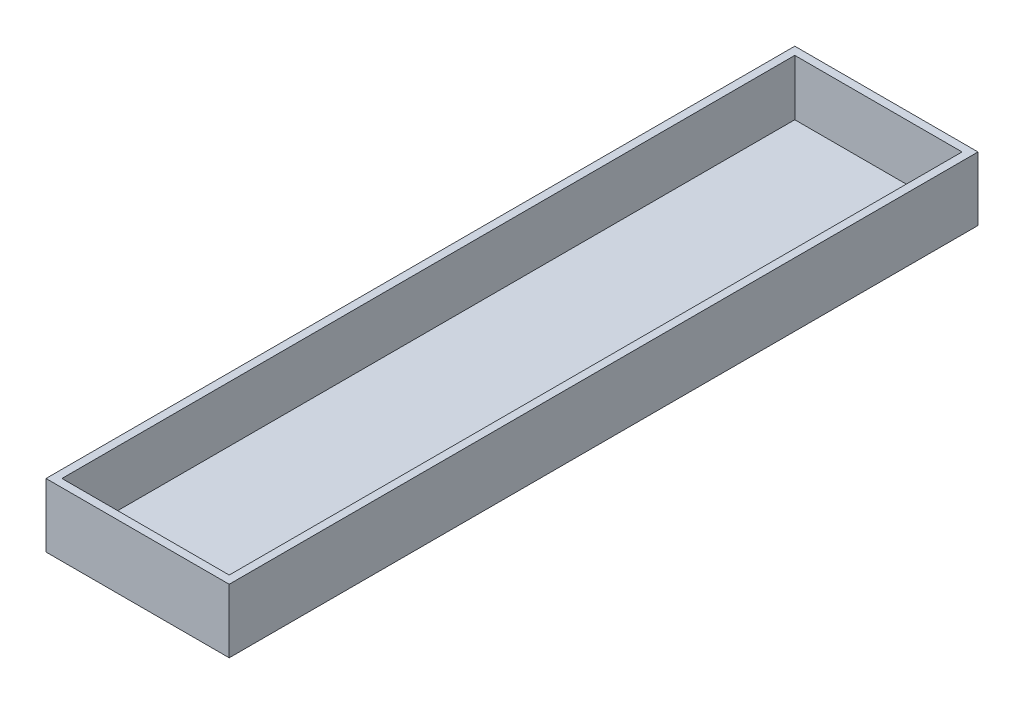
ISO-10303-21;
HEADER;
FILE_DESCRIPTION(('STEP AP214'),'2;1');
FILE_NAME('part.step','',(''),(''),'','','');
FILE_SCHEMA(('AUTOMOTIVE_DESIGN { 1 0 10303 214 1 1 1 1 }'));
ENDSEC;
DATA;
#1=APPLICATION_CONTEXT('core data for automotive mechanical design processes');
#2=APPLICATION_PROTOCOL_DEFINITION('international standard','automotive_design',2000,#1);
#3=PRODUCT_CONTEXT('',#1,'mechanical');
#4=PRODUCT('Part','Part','',(#3));
#5=PRODUCT_RELATED_PRODUCT_CATEGORY('part','',(#4));
#6=PRODUCT_DEFINITION_FORMATION('','',#4);
#7=PRODUCT_DEFINITION_CONTEXT('part definition',#1,'design');
#8=PRODUCT_DEFINITION('design','',#6,#7);
#9=PRODUCT_DEFINITION_SHAPE('','',#8);
#10=(LENGTH_UNIT() NAMED_UNIT(*) SI_UNIT(.MILLI.,.METRE.));
#11=(NAMED_UNIT(*) PLANE_ANGLE_UNIT() SI_UNIT($,.RADIAN.));
#12=(NAMED_UNIT(*) SI_UNIT($,.STERADIAN.) SOLID_ANGLE_UNIT());
#13=UNCERTAINTY_MEASURE_WITH_UNIT(LENGTH_MEASURE(1.E-05),#10,'distance_accuracy_value','');
#14=(GEOMETRIC_REPRESENTATION_CONTEXT(3) GLOBAL_UNCERTAINTY_ASSIGNED_CONTEXT((#13)) GLOBAL_UNIT_ASSIGNED_CONTEXT((#10,
#11,#12)) REPRESENTATION_CONTEXT('',''));
#15=CARTESIAN_POINT('',(0.,0.,0.));
#16=DIRECTION('',(0.,0.,1.));
#17=DIRECTION('',(1.,0.,0.));
#18=AXIS2_PLACEMENT_3D('',#15,#16,#17);
#19=CARTESIAN_POINT('',(0.,0.,94000.));
#20=DIRECTION('',(1.,0.,0.));
#21=DIRECTION('',(0.,1.,0.));
#22=AXIS2_PLACEMENT_3D('',#19,#20,#21);
#23=PLANE('',#22);
#24=DIRECTION('',(0.,-1.,0.));
#25=VECTOR('',#24,1.);
#26=CARTESIAN_POINT('',(0.,0.,0.));
#27=LINE('',#26,#25);
#28=CARTESIAN_POINT('',(-1.66533453693773E-12,8000.,0.));
#29=VERTEX_POINT('',#28);
#30=CARTESIAN_POINT('',(0.,0.,0.));
#31=VERTEX_POINT('',#30);
#32=EDGE_CURVE('E143',#29,#31,#27,.T.);
#33=ORIENTED_EDGE('',*,*,#32,.T.);
#34=DIRECTION('',(0.,0.,-1.));
#35=VECTOR('',#34,1.);
#36=CARTESIAN_POINT('',(0.,0.,94000.));
#37=LINE('',#36,#35);
#38=CARTESIAN_POINT('',(0.,0.,94000.));
#39=VERTEX_POINT('',#38);
#40=EDGE_CURVE('E12',#39,#31,#37,.T.);
#41=ORIENTED_EDGE('',*,*,#40,.F.);
#42=DIRECTION('',(0.,-1.,0.));
#43=VECTOR('',#42,1.);
#44=CARTESIAN_POINT('',(0.,0.,94000.));
#45=LINE('',#44,#43);
#46=CARTESIAN_POINT('',(-1.66533453693773E-12,8000.,94000.));
#47=VERTEX_POINT('',#46);
#48=EDGE_CURVE('E145',#47,#39,#45,.T.);
#49=ORIENTED_EDGE('',*,*,#48,.F.);
#50=DIRECTION('',(0.,0.,-1.));
#51=VECTOR('',#50,1.);
#52=CARTESIAN_POINT('',(-1.66533453693773E-12,8000.,94000.));
#53=LINE('',#52,#51);
#54=EDGE_CURVE('E151',#47,#29,#53,.T.);
#55=ORIENTED_EDGE('',*,*,#54,.T.);
#56=EDGE_LOOP('',(#33,#41,#49,#55));
#57=FACE_BOUND('',#56,.T.);
#58=ADVANCED_FACE('F37',(#57),#23,.F.);
#59=CARTESIAN_POINT('',(0.,0.,94000.));
#60=DIRECTION('',(0.,1.,0.));
#61=DIRECTION('',(0.,0.,1.));
#62=AXIS2_PLACEMENT_3D('',#59,#60,#61);
#63=PLANE('',#62);
#64=DIRECTION('',(1.,0.,0.));
#65=VECTOR('',#64,1.);
#66=CARTESIAN_POINT('',(0.,0.,0.));
#67=LINE('',#66,#65);
#68=CARTESIAN_POINT('',(23000.,0.,0.));
#69=VERTEX_POINT('',#68);
#70=EDGE_CURVE('E154',#31,#69,#67,.T.);
#71=ORIENTED_EDGE('',*,*,#70,.T.);
#72=DIRECTION('',(0.,0.,-1.));
#73=VECTOR('',#72,1.);
#74=CARTESIAN_POINT('',(23000.,0.,94000.));
#75=LINE('',#74,#73);
#76=CARTESIAN_POINT('',(23000.,0.,94000.));
#77=VERTEX_POINT('',#76);
#78=EDGE_CURVE('E44',#77,#69,#75,.T.);
#79=ORIENTED_EDGE('',*,*,#78,.F.);
#80=DIRECTION('',(1.,0.,0.));
#81=VECTOR('',#80,1.);
#82=CARTESIAN_POINT('',(0.,0.,94000.));
#83=LINE('',#82,#81);
#84=EDGE_CURVE('E88',#39,#77,#83,.T.);
#85=ORIENTED_EDGE('',*,*,#84,.F.);
#86=ORIENTED_EDGE('',*,*,#40,.T.);
#87=EDGE_LOOP('',(#71,#79,#85,#86));
#88=FACE_BOUND('',#87,.T.);
#89=ADVANCED_FACE('F181',(#88),#63,.F.);
#90=CARTESIAN_POINT('',(23000.,0.,94000.));
#91=DIRECTION('',(-1.,0.,0.));
#92=DIRECTION('',(0.,-1.,0.));
#93=AXIS2_PLACEMENT_3D('',#90,#91,#92);
#94=PLANE('',#93);
#95=DIRECTION('',(0.,1.,0.));
#96=VECTOR('',#95,1.);
#97=CARTESIAN_POINT('',(23000.,0.,0.));
#98=LINE('',#97,#96);
#99=CARTESIAN_POINT('',(23000.,8000.,0.));
#100=VERTEX_POINT('',#99);
#101=EDGE_CURVE('E156',#69,#100,#98,.T.);
#102=ORIENTED_EDGE('',*,*,#101,.T.);
#103=DIRECTION('',(0.,0.,-1.));
#104=VECTOR('',#103,1.);
#105=CARTESIAN_POINT('',(23000.,8000.,94000.));
#106=LINE('',#105,#104);
#107=CARTESIAN_POINT('',(23000.,8000.,94000.));
#108=VERTEX_POINT('',#107);
#109=EDGE_CURVE('E160',#108,#100,#106,.T.);
#110=ORIENTED_EDGE('',*,*,#109,.F.);
#111=DIRECTION('',(0.,1.,0.));
#112=VECTOR('',#111,1.);
#113=CARTESIAN_POINT('',(23000.,0.,94000.));
#114=LINE('',#113,#112);
#115=EDGE_CURVE('E148',#77,#108,#114,.T.);
#116=ORIENTED_EDGE('',*,*,#115,.F.);
#117=ORIENTED_EDGE('',*,*,#78,.T.);
#118=EDGE_LOOP('',(#102,#110,#116,#117));
#119=FACE_BOUND('',#118,.T.);
#120=ADVANCED_FACE('F165',(#119),#94,.F.);
#121=CARTESIAN_POINT('',(-1.66533453693773E-12,8000.,94000.));
#122=DIRECTION('',(0.,-1.,0.));
#123=DIRECTION('',(0.,0.,-1.));
#124=AXIS2_PLACEMENT_3D('',#121,#122,#123);
#125=PLANE('',#124);
#126=DIRECTION('',(1.,0.,0.));
#127=VECTOR('',#126,1.);
#128=CARTESIAN_POINT('',(999.999999999999,8000.,93000.));
#129=LINE('',#128,#127);
#130=CARTESIAN_POINT('',(999.999999999999,8000.,93000.));
#131=VERTEX_POINT('',#130);
#132=CARTESIAN_POINT('',(22000.,8000.,93000.));
#133=VERTEX_POINT('',#132);
#134=EDGE_CURVE('E126',#131,#133,#129,.T.);
#135=ORIENTED_EDGE('',*,*,#134,.F.);
#136=DIRECTION('',(0.,0.,1.));
#137=VECTOR('',#136,1.);
#138=CARTESIAN_POINT('',(999.999999999999,8000.,93000.));
#139=LINE('',#138,#137);
#140=CARTESIAN_POINT('',(999.999999999998,8000.,1000.));
#141=VERTEX_POINT('',#140);
#142=EDGE_CURVE('E51',#141,#131,#139,.T.);
#143=ORIENTED_EDGE('',*,*,#142,.F.);
#144=DIRECTION('',(-1.,0.,0.));
#145=VECTOR('',#144,1.);
#146=CARTESIAN_POINT('',(999.999999999998,8000.,1000.));
#147=LINE('',#146,#145);
#148=CARTESIAN_POINT('',(22000.,8000.,1000.));
#149=VERTEX_POINT('',#148);
#150=EDGE_CURVE('E132',#149,#141,#147,.T.);
#151=ORIENTED_EDGE('',*,*,#150,.F.);
#152=DIRECTION('',(0.,0.,-1.));
#153=VECTOR('',#152,1.);
#154=CARTESIAN_POINT('',(22000.,8000.,93000.));
#155=LINE('',#154,#153);
#156=EDGE_CURVE('E116',#133,#149,#155,.T.);
#157=ORIENTED_EDGE('',*,*,#156,.F.);
#158=EDGE_LOOP('',(#135,#143,#151,#157));
#159=FACE_BOUND('',#158,.T.);
#160=DIRECTION('',(-1.,0.,0.));
#161=VECTOR('',#160,1.);
#162=CARTESIAN_POINT('',(-1.66533453693773E-12,8000.,0.));
#163=LINE('',#162,#161);
#164=EDGE_CURVE('E81',#100,#29,#163,.T.);
#165=ORIENTED_EDGE('',*,*,#164,.T.);
#166=ORIENTED_EDGE('',*,*,#54,.F.);
#167=DIRECTION('',(-1.,0.,0.));
#168=VECTOR('',#167,1.);
#169=CARTESIAN_POINT('',(-1.66533453693773E-12,8000.,94000.));
#170=LINE('',#169,#168);
#171=EDGE_CURVE('E60',#108,#47,#170,.T.);
#172=ORIENTED_EDGE('',*,*,#171,.F.);
#173=ORIENTED_EDGE('',*,*,#109,.T.);
#174=EDGE_LOOP('',(#165,#166,#172,#173));
#175=FACE_BOUND('',#174,.T.);
#176=ADVANCED_FACE('F130',(#159,#175),#125,.F.);
#177=CARTESIAN_POINT('',(0.,0.,94000.));
#178=DIRECTION('',(0.,0.,-1.));
#179=DIRECTION('',(-1.,0.,0.));
#180=AXIS2_PLACEMENT_3D('',#177,#178,#179);
#181=PLANE('',#180);
#182=ORIENTED_EDGE('',*,*,#48,.T.);
#183=ORIENTED_EDGE('',*,*,#84,.T.);
#184=ORIENTED_EDGE('',*,*,#115,.T.);
#185=ORIENTED_EDGE('',*,*,#171,.T.);
#186=EDGE_LOOP('',(#182,#183,#184,#185));
#187=FACE_BOUND('',#186,.T.);
#188=ADVANCED_FACE('F174',(#187),#181,.F.);
#189=CARTESIAN_POINT('',(0.,0.,0.));
#190=DIRECTION('',(0.,0.,-1.));
#191=DIRECTION('',(-1.,0.,0.));
#192=AXIS2_PLACEMENT_3D('',#189,#190,#191);
#193=PLANE('',#192);
#194=ORIENTED_EDGE('',*,*,#32,.F.);
#195=ORIENTED_EDGE('',*,*,#164,.F.);
#196=ORIENTED_EDGE('',*,*,#101,.F.);
#197=ORIENTED_EDGE('',*,*,#70,.F.);
#198=EDGE_LOOP('',(#194,#195,#196,#197));
#199=FACE_BOUND('',#198,.T.);
#200=ADVANCED_FACE('F169',(#199),#193,.T.);
#201=CARTESIAN_POINT('',(999.999999999999,-94366.3075467086,93000.));
#202=DIRECTION('',(-1.,0.,0.));
#203=DIRECTION('',(0.,0.,1.));
#204=AXIS2_PLACEMENT_3D('',#201,#202,#203);
#205=PLANE('',#204);
#206=DIRECTION('',(0.,0.,-1.));
#207=VECTOR('',#206,1.);
#208=CARTESIAN_POINT('',(999.999999999999,1000.,93000.));
#209=LINE('',#208,#207);
#210=CARTESIAN_POINT('',(999.999999999999,1000.,93000.));
#211=VERTEX_POINT('',#210);
#212=CARTESIAN_POINT('',(999.999999999998,1000.,1000.));
#213=VERTEX_POINT('',#212);
#214=EDGE_CURVE('E144',#211,#213,#209,.T.);
#215=ORIENTED_EDGE('',*,*,#214,.T.);
#216=DIRECTION('',(0.,1.,0.));
#217=VECTOR('',#216,1.);
#218=CARTESIAN_POINT('',(999.999999999998,-94366.3075467086,1000.));
#219=LINE('',#218,#217);
#220=EDGE_CURVE('E137',#213,#141,#219,.T.);
#221=ORIENTED_EDGE('',*,*,#220,.T.);
#222=ORIENTED_EDGE('',*,*,#142,.T.);
#223=DIRECTION('',(0.,1.,0.));
#224=VECTOR('',#223,1.);
#225=CARTESIAN_POINT('',(999.999999999999,-94366.3075467086,93000.));
#226=LINE('',#225,#224);
#227=EDGE_CURVE('E123',#211,#131,#226,.T.);
#228=ORIENTED_EDGE('',*,*,#227,.F.);
#229=EDGE_LOOP('',(#215,#221,#222,#228));
#230=FACE_BOUND('',#229,.T.);
#231=ADVANCED_FACE('F209',(#230),#205,.F.);
#232=CARTESIAN_POINT('',(999.999999999998,-94366.3075467086,1000.));
#233=DIRECTION('',(0.,0.,-1.));
#234=DIRECTION('',(-1.,0.,0.));
#235=AXIS2_PLACEMENT_3D('',#232,#233,#234);
#236=PLANE('',#235);
#237=DIRECTION('',(1.,0.,0.));
#238=VECTOR('',#237,1.);
#239=CARTESIAN_POINT('',(999.999999999998,1000.,1000.));
#240=LINE('',#239,#238);
#241=CARTESIAN_POINT('',(22000.,1000.,1000.));
#242=VERTEX_POINT('',#241);
#243=EDGE_CURVE('E262',#213,#242,#240,.T.);
#244=ORIENTED_EDGE('',*,*,#243,.T.);
#245=DIRECTION('',(0.,1.,0.));
#246=VECTOR('',#245,1.);
#247=CARTESIAN_POINT('',(22000.,-94366.3075467086,1000.));
#248=LINE('',#247,#246);
#249=EDGE_CURVE('E122',#242,#149,#248,.T.);
#250=ORIENTED_EDGE('',*,*,#249,.T.);
#251=ORIENTED_EDGE('',*,*,#150,.T.);
#252=ORIENTED_EDGE('',*,*,#220,.F.);
#253=EDGE_LOOP('',(#244,#250,#251,#252));
#254=FACE_BOUND('',#253,.T.);
#255=ADVANCED_FACE('F221',(#254),#236,.F.);
#256=CARTESIAN_POINT('',(22000.,-94366.3075467086,93000.));
#257=DIRECTION('',(1.,0.,0.));
#258=DIRECTION('',(0.,0.,-1.));
#259=AXIS2_PLACEMENT_3D('',#256,#257,#258);
#260=PLANE('',#259);
#261=DIRECTION('',(0.,0.,1.));
#262=VECTOR('',#261,1.);
#263=CARTESIAN_POINT('',(22000.,1000.,93000.));
#264=LINE('',#263,#262);
#265=CARTESIAN_POINT('',(22000.,999.999999999972,93000.));
#266=VERTEX_POINT('',#265);
#267=EDGE_CURVE('E119',#242,#266,#264,.T.);
#268=ORIENTED_EDGE('',*,*,#267,.T.);
#269=DIRECTION('',(0.,1.,0.));
#270=VECTOR('',#269,1.);
#271=CARTESIAN_POINT('',(22000.,-94366.3075467086,93000.));
#272=LINE('',#271,#270);
#273=EDGE_CURVE('E111',#266,#133,#272,.T.);
#274=ORIENTED_EDGE('',*,*,#273,.T.);
#275=ORIENTED_EDGE('',*,*,#156,.T.);
#276=ORIENTED_EDGE('',*,*,#249,.F.);
#277=EDGE_LOOP('',(#268,#274,#275,#276));
#278=FACE_BOUND('',#277,.T.);
#279=ADVANCED_FACE('F113',(#278),#260,.F.);
#280=CARTESIAN_POINT('',(999.999999999999,-94366.3075467086,93000.));
#281=DIRECTION('',(0.,0.,1.));
#282=DIRECTION('',(1.,0.,0.));
#283=AXIS2_PLACEMENT_3D('',#280,#281,#282);
#284=PLANE('',#283);
#285=DIRECTION('',(-1.,0.,0.));
#286=VECTOR('',#285,1.);
#287=CARTESIAN_POINT('',(999.999999999999,1000.,93000.));
#288=LINE('',#287,#286);
#289=EDGE_CURVE('E141',#266,#211,#288,.T.);
#290=ORIENTED_EDGE('',*,*,#289,.T.);
#291=ORIENTED_EDGE('',*,*,#227,.T.);
#292=ORIENTED_EDGE('',*,*,#134,.T.);
#293=ORIENTED_EDGE('',*,*,#273,.F.);
#294=EDGE_LOOP('',(#290,#291,#292,#293));
#295=FACE_BOUND('',#294,.T.);
#296=ADVANCED_FACE('F127',(#295),#284,.F.);
#297=CARTESIAN_POINT('',(0.,1000.,94000.));
#298=DIRECTION('',(0.,1.,0.));
#299=DIRECTION('',(0.,0.,1.));
#300=AXIS2_PLACEMENT_3D('',#297,#298,#299);
#301=PLANE('',#300);
#302=ORIENTED_EDGE('',*,*,#214,.F.);
#303=ORIENTED_EDGE('',*,*,#289,.F.);
#304=ORIENTED_EDGE('',*,*,#267,.F.);
#305=ORIENTED_EDGE('',*,*,#243,.F.);
#306=EDGE_LOOP('',(#302,#303,#304,#305));
#307=FACE_BOUND('',#306,.T.);
#308=ADVANCED_FACE('F247',(#307),#301,.T.);
#309=CLOSED_SHELL('',(#58,#89,#120,#176,#188,#200,#231,#255,#279,#296,#308));
#310=MANIFOLD_SOLID_BREP('B2',#309);
#311=ADVANCED_BREP_SHAPE_REPRESENTATION('',(#18,#310),#14);
#312=SHAPE_DEFINITION_REPRESENTATION(#9,#311);
ENDSEC;
END-ISO-10303-21;
